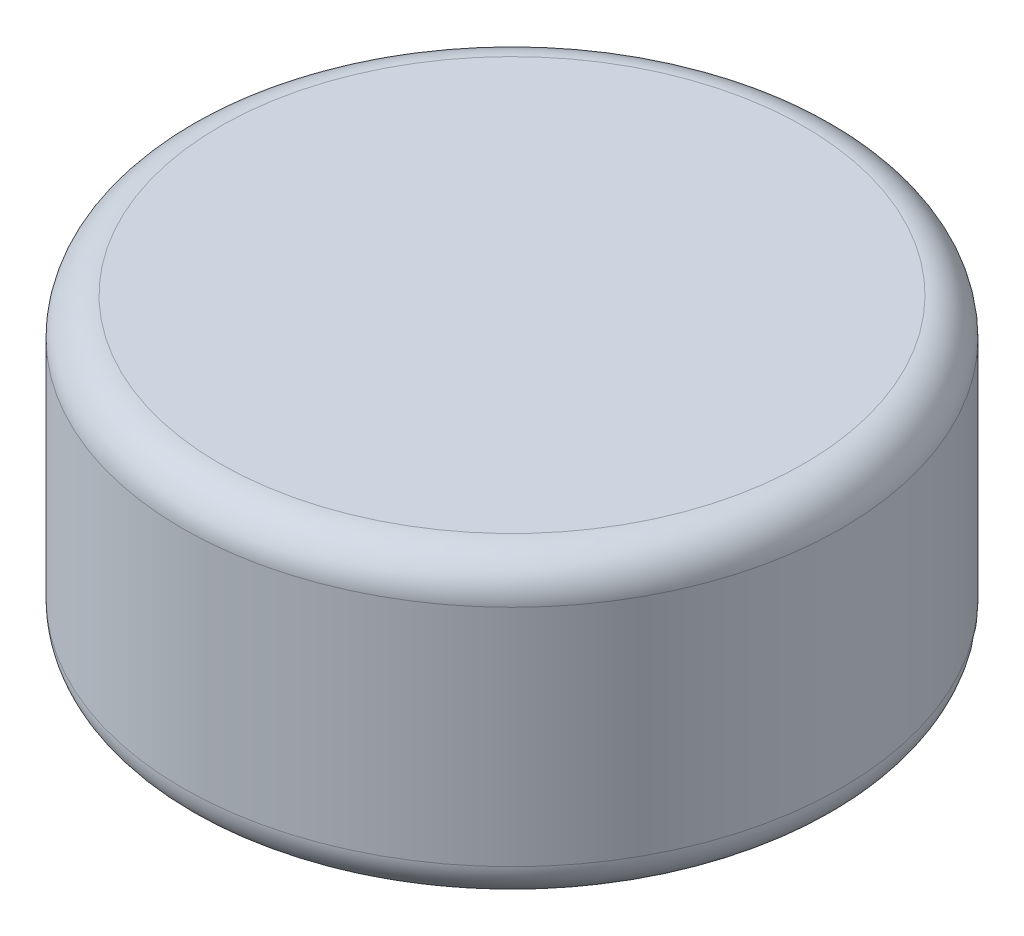
ISO-10303-21;
HEADER;
FILE_DESCRIPTION(('STEP AP214'),'2;1');
FILE_NAME('part.step','',(''),(''),'','','');
FILE_SCHEMA(('AUTOMOTIVE_DESIGN { 1 0 10303 214 1 1 1 1 }'));
ENDSEC;
DATA;
#1=APPLICATION_CONTEXT('core data for automotive mechanical design processes');
#2=APPLICATION_PROTOCOL_DEFINITION('international standard','automotive_design',2000,#1);
#3=PRODUCT_CONTEXT('',#1,'mechanical');
#4=PRODUCT('Part','Part','',(#3));
#5=PRODUCT_RELATED_PRODUCT_CATEGORY('part','',(#4));
#6=PRODUCT_DEFINITION_FORMATION('','',#4);
#7=PRODUCT_DEFINITION_CONTEXT('part definition',#1,'design');
#8=PRODUCT_DEFINITION('design','',#6,#7);
#9=PRODUCT_DEFINITION_SHAPE('','',#8);
#10=(LENGTH_UNIT() NAMED_UNIT(*) SI_UNIT(.MILLI.,.METRE.));
#11=(NAMED_UNIT(*) PLANE_ANGLE_UNIT() SI_UNIT($,.RADIAN.));
#12=(NAMED_UNIT(*) SI_UNIT($,.STERADIAN.) SOLID_ANGLE_UNIT());
#13=UNCERTAINTY_MEASURE_WITH_UNIT(LENGTH_MEASURE(1.E-05),#10,'distance_accuracy_value','');
#14=(GEOMETRIC_REPRESENTATION_CONTEXT(3) GLOBAL_UNCERTAINTY_ASSIGNED_CONTEXT((#13)) GLOBAL_UNIT_ASSIGNED_CONTEXT((#10,
#11,#12)) REPRESENTATION_CONTEXT('',''));
#15=CARTESIAN_POINT('',(0.,0.,0.));
#16=DIRECTION('',(0.,0.,1.));
#17=DIRECTION('',(1.,0.,0.));
#18=AXIS2_PLACEMENT_3D('',#15,#16,#17);
#19=CARTESIAN_POINT('',(0.,-50.8,0.));
#20=DIRECTION('',(0.,1.,0.));
#21=DIRECTION('',(0.,0.,1.));
#22=AXIS2_PLACEMENT_3D('',#19,#20,#21);
#23=CYLINDRICAL_SURFACE('',#22,55.88);
#24=CARTESIAN_POINT('',(0.,-44.45,0.));
#25=DIRECTION('',(0.,1.,0.));
#26=DIRECTION('',(0.,0.,1.));
#27=AXIS2_PLACEMENT_3D('',#24,#25,#26);
#28=CIRCLE('',#27,55.88);
#29=CARTESIAN_POINT('',(0.,-44.45,55.88));
#30=VERTEX_POINT('',#29);
#31=EDGE_CURVE('E42',#30,#30,#28,.T.);
#32=ORIENTED_EDGE('',*,*,#31,.T.);
#33=EDGE_LOOP('',(#32));
#34=FACE_BOUND('',#33,.T.);
#35=CARTESIAN_POINT('',(0.,-6.35,0.));
#36=DIRECTION('',(0.,1.,0.));
#37=DIRECTION('',(0.,0.,1.));
#38=AXIS2_PLACEMENT_3D('',#35,#36,#37);
#39=CIRCLE('',#38,55.88);
#40=CARTESIAN_POINT('',(0.,-6.35,55.88));
#41=VERTEX_POINT('',#40);
#42=EDGE_CURVE('E46',#41,#41,#39,.F.);
#43=ORIENTED_EDGE('',*,*,#42,.T.);
#44=EDGE_LOOP('',(#43));
#45=FACE_BOUND('',#44,.T.);
#46=ADVANCED_FACE('F31',(#34,#45),#23,.T.);
#47=CARTESIAN_POINT('',(0.,-50.8,0.));
#48=DIRECTION('',(0.,1.,0.));
#49=DIRECTION('',(0.,0.,1.));
#50=AXIS2_PLACEMENT_3D('',#47,#48,#49);
#51=PLANE('',#50);
#52=CARTESIAN_POINT('',(0.,-50.8,0.));
#53=DIRECTION('',(0.,1.,0.));
#54=DIRECTION('',(0.,0.,1.));
#55=AXIS2_PLACEMENT_3D('',#52,#53,#54);
#56=CIRCLE('',#55,49.53);
#57=CARTESIAN_POINT('',(0.,-50.8,49.53));
#58=VERTEX_POINT('',#57);
#59=EDGE_CURVE('E38',#58,#58,#56,.F.);
#60=ORIENTED_EDGE('',*,*,#59,.T.);
#61=EDGE_LOOP('',(#60));
#62=FACE_BOUND('',#61,.T.);
#63=ADVANCED_FACE('F62',(#62),#51,.F.);
#64=CARTESIAN_POINT('',(0.,0.,0.));
#65=DIRECTION('',(0.,1.,0.));
#66=DIRECTION('',(0.,0.,1.));
#67=AXIS2_PLACEMENT_3D('',#64,#65,#66);
#68=PLANE('',#67);
#69=CARTESIAN_POINT('',(0.,0.,0.));
#70=DIRECTION('',(0.,1.,0.));
#71=DIRECTION('',(0.,0.,1.));
#72=AXIS2_PLACEMENT_3D('',#69,#70,#71);
#73=CIRCLE('',#72,49.53);
#74=CARTESIAN_POINT('',(0.,0.,49.53));
#75=VERTEX_POINT('',#74);
#76=EDGE_CURVE('E10',#75,#75,#73,.T.);
#77=ORIENTED_EDGE('',*,*,#76,.T.);
#78=EDGE_LOOP('',(#77));
#79=FACE_BOUND('',#78,.T.);
#80=ADVANCED_FACE('F59',(#79),#68,.T.);
#81=CARTESIAN_POINT('',(0.,-44.45,0.));
#82=DIRECTION('',(0.,1.,0.));
#83=DIRECTION('',(0.,0.,1.));
#84=AXIS2_PLACEMENT_3D('',#81,#82,#83);
#85=TOROIDAL_SURFACE('',#84,49.53,6.35);
#86=ORIENTED_EDGE('',*,*,#59,.F.);
#87=EDGE_LOOP('',(#86));
#88=FACE_BOUND('',#87,.T.);
#89=ORIENTED_EDGE('',*,*,#31,.F.);
#90=EDGE_LOOP('',(#89));
#91=FACE_BOUND('',#90,.T.);
#92=ADVANCED_FACE('F55',(#88,#91),#85,.T.);
#93=CARTESIAN_POINT('',(0.,-6.35,0.));
#94=DIRECTION('',(0.,1.,0.));
#95=DIRECTION('',(0.,0.,1.));
#96=AXIS2_PLACEMENT_3D('',#93,#94,#95);
#97=TOROIDAL_SURFACE('',#96,49.53,6.35);
#98=ORIENTED_EDGE('',*,*,#42,.F.);
#99=EDGE_LOOP('',(#98));
#100=FACE_BOUND('',#99,.T.);
#101=ORIENTED_EDGE('',*,*,#76,.F.);
#102=EDGE_LOOP('',(#101));
#103=FACE_BOUND('',#102,.T.);
#104=ADVANCED_FACE('F33',(#100,#103),#97,.T.);
#105=CLOSED_SHELL('',(#46,#63,#80,#92,#104));
#106=MANIFOLD_SOLID_BREP('B2',#105);
#107=ADVANCED_BREP_SHAPE_REPRESENTATION('',(#18,#106),#14);
#108=SHAPE_DEFINITION_REPRESENTATION(#9,#107);
ENDSEC;
END-ISO-10303-21;
